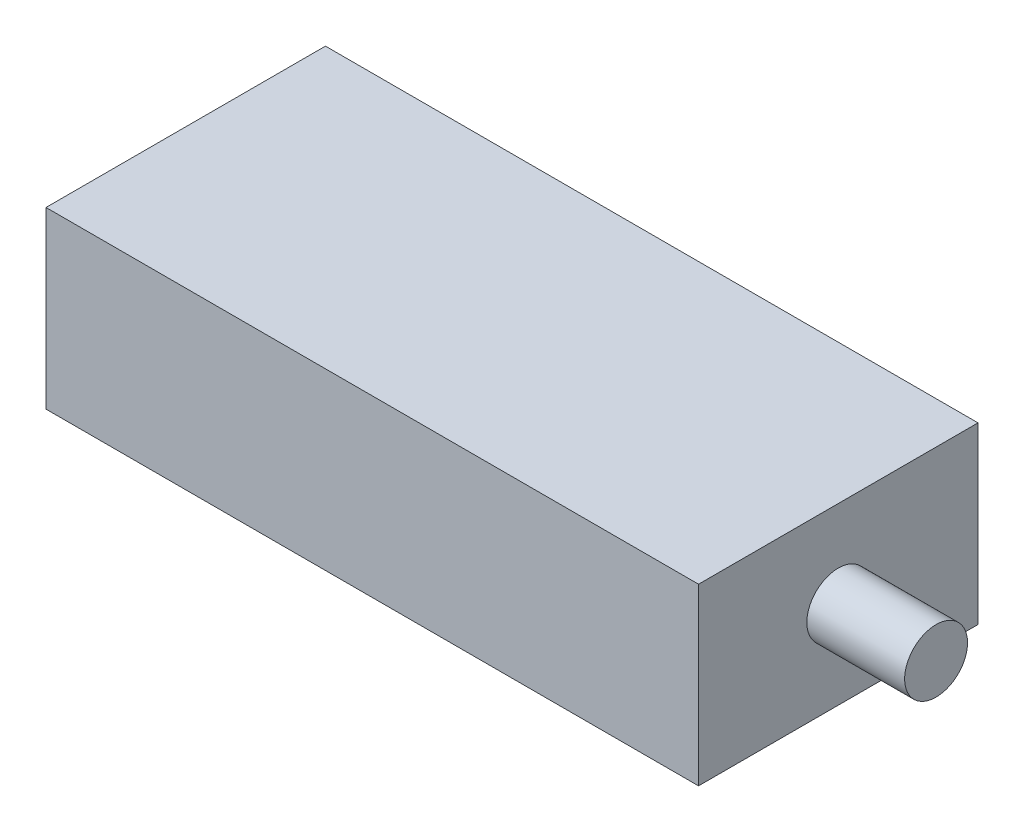
ISO-10303-21;
HEADER;
FILE_DESCRIPTION(('STEP AP214'),'2;1');
FILE_NAME('part.step','',(''),(''),'','','');
FILE_SCHEMA(('AUTOMOTIVE_DESIGN { 1 0 10303 214 1 1 1 1 }'));
ENDSEC;
DATA;
#1=APPLICATION_CONTEXT('core data for automotive mechanical design processes');
#2=APPLICATION_PROTOCOL_DEFINITION('international standard','automotive_design',2000,#1);
#3=PRODUCT_CONTEXT('',#1,'mechanical');
#4=PRODUCT('Part','Part','',(#3));
#5=PRODUCT_RELATED_PRODUCT_CATEGORY('part','',(#4));
#6=PRODUCT_DEFINITION_FORMATION('','',#4);
#7=PRODUCT_DEFINITION_CONTEXT('part definition',#1,'design');
#8=PRODUCT_DEFINITION('design','',#6,#7);
#9=PRODUCT_DEFINITION_SHAPE('','',#8);
#10=(LENGTH_UNIT() NAMED_UNIT(*) SI_UNIT(.MILLI.,.METRE.));
#11=(NAMED_UNIT(*) PLANE_ANGLE_UNIT() SI_UNIT($,.RADIAN.));
#12=(NAMED_UNIT(*) SI_UNIT($,.STERADIAN.) SOLID_ANGLE_UNIT());
#13=UNCERTAINTY_MEASURE_WITH_UNIT(LENGTH_MEASURE(1.E-05),#10,'distance_accuracy_value','');
#14=(GEOMETRIC_REPRESENTATION_CONTEXT(3) GLOBAL_UNCERTAINTY_ASSIGNED_CONTEXT((#13)) GLOBAL_UNIT_ASSIGNED_CONTEXT((#10,
#11,#12)) REPRESENTATION_CONTEXT('',''));
#15=CARTESIAN_POINT('',(0.,0.,0.));
#16=DIRECTION('',(0.,0.,1.));
#17=DIRECTION('',(1.,0.,0.));
#18=AXIS2_PLACEMENT_3D('',#15,#16,#17);
#19=CARTESIAN_POINT('',(59.309,31.75,25.4));
#20=DIRECTION('',(-1.,0.,0.));
#21=DIRECTION('',(0.,0.,1.));
#22=AXIS2_PLACEMENT_3D('',#19,#20,#21);
#23=PLANE('',#22);
#24=CARTESIAN_POINT('',(59.309,15.875,0.));
#25=DIRECTION('',(1.,0.,0.));
#26=DIRECTION('',(0.,0.,-1.));
#27=AXIS2_PLACEMENT_3D('',#24,#25,#26);
#28=CIRCLE('',#27,5.715);
#29=CARTESIAN_POINT('',(59.309,15.875,-5.715));
#30=VERTEX_POINT('',#29);
#31=EDGE_CURVE('E11',#30,#30,#28,.T.);
#32=ORIENTED_EDGE('',*,*,#31,.F.);
#33=EDGE_LOOP('',(#32));
#34=FACE_BOUND('',#33,.T.);
#35=DIRECTION('',(0.,0.,-1.));
#36=VECTOR('',#35,1.);
#37=CARTESIAN_POINT('',(59.309,0.,25.4));
#38=LINE('',#37,#36);
#39=CARTESIAN_POINT('',(59.309,0.,25.4));
#40=VERTEX_POINT('',#39);
#41=CARTESIAN_POINT('',(59.309,0.,-25.4));
#42=VERTEX_POINT('',#41);
#43=EDGE_CURVE('E232',#40,#42,#38,.T.);
#44=ORIENTED_EDGE('',*,*,#43,.T.);
#45=DIRECTION('',(0.,-1.,0.));
#46=VECTOR('',#45,1.);
#47=CARTESIAN_POINT('',(59.309,31.75,-25.4));
#48=LINE('',#47,#46);
#49=CARTESIAN_POINT('',(59.309,31.75,-25.4));
#50=VERTEX_POINT('',#49);
#51=EDGE_CURVE('E36',#50,#42,#48,.T.);
#52=ORIENTED_EDGE('',*,*,#51,.F.);
#53=DIRECTION('',(0.,0.,-1.));
#54=VECTOR('',#53,1.);
#55=CARTESIAN_POINT('',(59.309,31.75,25.4));
#56=LINE('',#55,#54);
#57=CARTESIAN_POINT('',(59.309,31.75,25.4));
#58=VERTEX_POINT('',#57);
#59=EDGE_CURVE('E234',#58,#50,#56,.T.);
#60=ORIENTED_EDGE('',*,*,#59,.F.);
#61=DIRECTION('',(0.,-1.,0.));
#62=VECTOR('',#61,1.);
#63=CARTESIAN_POINT('',(59.309,31.75,25.4));
#64=LINE('',#63,#62);
#65=EDGE_CURVE('E240',#58,#40,#64,.T.);
#66=ORIENTED_EDGE('',*,*,#65,.T.);
#67=EDGE_LOOP('',(#44,#52,#60,#66));
#68=FACE_BOUND('',#67,.T.);
#69=ADVANCED_FACE('F33',(#34,#68),#23,.F.);
#70=CARTESIAN_POINT('',(-59.309,31.75,-25.4));
#71=DIRECTION('',(0.,0.,1.));
#72=DIRECTION('',(1.,0.,0.));
#73=AXIS2_PLACEMENT_3D('',#70,#71,#72);
#74=PLANE('',#73);
#75=DIRECTION('',(-1.,0.,0.));
#76=VECTOR('',#75,1.);
#77=CARTESIAN_POINT('',(-59.309,0.,-25.4));
#78=LINE('',#77,#76);
#79=CARTESIAN_POINT('',(-59.309,0.,-25.4));
#80=VERTEX_POINT('',#79);
#81=EDGE_CURVE('E243',#42,#80,#78,.T.);
#82=ORIENTED_EDGE('',*,*,#81,.T.);
#83=DIRECTION('',(0.,-1.,0.));
#84=VECTOR('',#83,1.);
#85=CARTESIAN_POINT('',(-59.309,31.75,-25.4));
#86=LINE('',#85,#84);
#87=CARTESIAN_POINT('',(-59.309,31.75,-25.4));
#88=VERTEX_POINT('',#87);
#89=EDGE_CURVE('E250',#88,#80,#86,.T.);
#90=ORIENTED_EDGE('',*,*,#89,.F.);
#91=DIRECTION('',(-1.,0.,0.));
#92=VECTOR('',#91,1.);
#93=CARTESIAN_POINT('',(-59.309,31.75,-25.4));
#94=LINE('',#93,#92);
#95=EDGE_CURVE('E86',#50,#88,#94,.T.);
#96=ORIENTED_EDGE('',*,*,#95,.F.);
#97=ORIENTED_EDGE('',*,*,#51,.T.);
#98=EDGE_LOOP('',(#82,#90,#96,#97));
#99=FACE_BOUND('',#98,.T.);
#100=ADVANCED_FACE('F256',(#99),#74,.F.);
#101=CARTESIAN_POINT('',(-59.309,31.75,25.4));
#102=DIRECTION('',(1.,0.,0.));
#103=DIRECTION('',(0.,0.,-1.));
#104=AXIS2_PLACEMENT_3D('',#101,#102,#103);
#105=PLANE('',#104);
#106=DIRECTION('',(0.,0.,1.));
#107=VECTOR('',#106,1.);
#108=CARTESIAN_POINT('',(-59.309,11.6586,-7.9639526005716));
#109=LINE('',#108,#107);
#110=CARTESIAN_POINT('',(-59.309,11.6586,-7.9639526005716));
#111=VERTEX_POINT('',#110);
#112=CARTESIAN_POINT('',(-59.309,11.6586,-2.54));
#113=VERTEX_POINT('',#112);
#114=EDGE_CURVE('E191',#111,#113,#109,.T.);
#115=ORIENTED_EDGE('',*,*,#114,.F.);
#116=CARTESIAN_POINT('',(-59.309,15.875,-5.13051457583911));
#117=DIRECTION('',(-1.,0.,0.));
#118=DIRECTION('',(0.,0.,-1.));
#119=AXIS2_PLACEMENT_3D('',#116,#117,#118);
#120=CIRCLE('',#119,5.08);
#121=CARTESIAN_POINT('',(-59.309,20.0914,-7.9639526005716));
#122=VERTEX_POINT('',#121);
#123=EDGE_CURVE('E48',#122,#111,#120,.T.);
#124=ORIENTED_EDGE('',*,*,#123,.F.);
#125=DIRECTION('',(0.,0.,-1.));
#126=VECTOR('',#125,1.);
#127=CARTESIAN_POINT('',(-59.309,20.0914,-7.9639526005716));
#128=LINE('',#127,#126);
#129=CARTESIAN_POINT('',(-59.309,20.0914,-2.54));
#130=VERTEX_POINT('',#129);
#131=EDGE_CURVE('E165',#130,#122,#128,.T.);
#132=ORIENTED_EDGE('',*,*,#131,.F.);
#133=DIRECTION('',(0.,0.707106781186548,-0.707106781186547));
#134=VECTOR('',#133,1.);
#135=CARTESIAN_POINT('',(-59.309,20.0914,-2.54));
#136=LINE('',#135,#134);
#137=CARTESIAN_POINT('',(-59.309,17.5514,0.));
#138=VERTEX_POINT('',#137);
#139=EDGE_CURVE('E168',#138,#130,#136,.T.);
#140=ORIENTED_EDGE('',*,*,#139,.F.);
#141=DIRECTION('',(0.,-0.707106781186548,-0.707106781186548));
#142=VECTOR('',#141,1.);
#143=CARTESIAN_POINT('',(-59.309,20.0914,2.54));
#144=LINE('',#143,#142);
#145=CARTESIAN_POINT('',(-59.309,20.0914,2.54));
#146=VERTEX_POINT('',#145);
#147=EDGE_CURVE('E208',#146,#138,#144,.T.);
#148=ORIENTED_EDGE('',*,*,#147,.F.);
#149=DIRECTION('',(0.,0.,-1.));
#150=VECTOR('',#149,1.);
#151=CARTESIAN_POINT('',(-59.309,20.0914,7.9639526005716));
#152=LINE('',#151,#150);
#153=CARTESIAN_POINT('',(-59.309,20.0914,7.9639526005716));
#154=VERTEX_POINT('',#153);
#155=EDGE_CURVE('E205',#154,#146,#152,.T.);
#156=ORIENTED_EDGE('',*,*,#155,.F.);
#157=CARTESIAN_POINT('',(-59.309,15.875,5.13051457583911));
#158=DIRECTION('',(-1.,0.,0.));
#159=DIRECTION('',(0.,0.,1.));
#160=AXIS2_PLACEMENT_3D('',#157,#158,#159);
#161=CIRCLE('',#160,5.08);
#162=CARTESIAN_POINT('',(-59.309,11.6586,7.9639526005716));
#163=VERTEX_POINT('',#162);
#164=EDGE_CURVE('E202',#163,#154,#161,.T.);
#165=ORIENTED_EDGE('',*,*,#164,.F.);
#166=DIRECTION('',(0.,0.,1.));
#167=VECTOR('',#166,1.);
#168=CARTESIAN_POINT('',(-59.309,11.6586,7.9639526005716));
#169=LINE('',#168,#167);
#170=CARTESIAN_POINT('',(-59.309,11.6586,2.54));
#171=VERTEX_POINT('',#170);
#172=EDGE_CURVE('E199',#171,#163,#169,.T.);
#173=ORIENTED_EDGE('',*,*,#172,.F.);
#174=DIRECTION('',(0.,-0.707106781186548,0.707106781186547));
#175=VECTOR('',#174,1.);
#176=CARTESIAN_POINT('',(-59.309,11.6586,2.54));
#177=LINE('',#176,#175);
#178=CARTESIAN_POINT('',(-59.309,14.1986,0.));
#179=VERTEX_POINT('',#178);
#180=EDGE_CURVE('E196',#179,#171,#177,.T.);
#181=ORIENTED_EDGE('',*,*,#180,.F.);
#182=DIRECTION('',(0.,0.707106781186547,0.707106781186548));
#183=VECTOR('',#182,1.);
#184=CARTESIAN_POINT('',(-59.309,11.6586,-2.54));
#185=LINE('',#184,#183);
#186=EDGE_CURVE('E193',#113,#179,#185,.T.);
#187=ORIENTED_EDGE('',*,*,#186,.F.);
#188=EDGE_LOOP('',(#115,#124,#132,#140,#148,#156,#165,#173,#181,#187));
#189=FACE_BOUND('',#188,.T.);
#190=DIRECTION('',(0.,0.,1.));
#191=VECTOR('',#190,1.);
#192=CARTESIAN_POINT('',(-59.309,0.,25.4));
#193=LINE('',#192,#191);
#194=CARTESIAN_POINT('',(-59.309,0.,25.4));
#195=VERTEX_POINT('',#194);
#196=EDGE_CURVE('E245',#80,#195,#193,.T.);
#197=ORIENTED_EDGE('',*,*,#196,.T.);
#198=DIRECTION('',(0.,-1.,0.));
#199=VECTOR('',#198,1.);
#200=CARTESIAN_POINT('',(-59.309,31.75,25.4));
#201=LINE('',#200,#199);
#202=CARTESIAN_POINT('',(-59.309,31.75,25.4));
#203=VERTEX_POINT('',#202);
#204=EDGE_CURVE('E249',#203,#195,#201,.T.);
#205=ORIENTED_EDGE('',*,*,#204,.F.);
#206=DIRECTION('',(0.,0.,1.));
#207=VECTOR('',#206,1.);
#208=CARTESIAN_POINT('',(-59.309,31.75,25.4));
#209=LINE('',#208,#207);
#210=EDGE_CURVE('E237',#88,#203,#209,.T.);
#211=ORIENTED_EDGE('',*,*,#210,.F.);
#212=ORIENTED_EDGE('',*,*,#89,.T.);
#213=EDGE_LOOP('',(#197,#205,#211,#212));
#214=FACE_BOUND('',#213,.T.);
#215=ADVANCED_FACE('F263',(#189,#214),#105,.F.);
#216=CARTESIAN_POINT('',(-59.309,31.75,25.4));
#217=DIRECTION('',(0.,0.,-1.));
#218=DIRECTION('',(-1.,0.,0.));
#219=AXIS2_PLACEMENT_3D('',#216,#217,#218);
#220=PLANE('',#219);
#221=DIRECTION('',(1.,0.,0.));
#222=VECTOR('',#221,1.);
#223=CARTESIAN_POINT('',(-59.309,0.,25.4));
#224=LINE('',#223,#222);
#225=EDGE_CURVE('E78',#195,#40,#224,.T.);
#226=ORIENTED_EDGE('',*,*,#225,.T.);
#227=ORIENTED_EDGE('',*,*,#65,.F.);
#228=DIRECTION('',(1.,0.,0.));
#229=VECTOR('',#228,1.);
#230=CARTESIAN_POINT('',(-59.309,31.75,25.4));
#231=LINE('',#230,#229);
#232=EDGE_CURVE('E57',#203,#58,#231,.T.);
#233=ORIENTED_EDGE('',*,*,#232,.F.);
#234=ORIENTED_EDGE('',*,*,#204,.T.);
#235=EDGE_LOOP('',(#226,#227,#233,#234));
#236=FACE_BOUND('',#235,.T.);
#237=ADVANCED_FACE('F264',(#236),#220,.F.);
#238=CARTESIAN_POINT('',(0.,31.75,0.));
#239=DIRECTION('',(0.,-1.,0.));
#240=DIRECTION('',(0.,0.,-1.));
#241=AXIS2_PLACEMENT_3D('',#238,#239,#240);
#242=PLANE('',#241);
#243=ORIENTED_EDGE('',*,*,#59,.T.);
#244=ORIENTED_EDGE('',*,*,#95,.T.);
#245=ORIENTED_EDGE('',*,*,#210,.T.);
#246=ORIENTED_EDGE('',*,*,#232,.T.);
#247=EDGE_LOOP('',(#243,#244,#245,#246));
#248=FACE_BOUND('',#247,.T.);
#249=ADVANCED_FACE('F265',(#248),#242,.F.);
#250=CARTESIAN_POINT('',(0.,0.,0.));
#251=DIRECTION('',(0.,-1.,0.));
#252=DIRECTION('',(0.,0.,-1.));
#253=AXIS2_PLACEMENT_3D('',#250,#251,#252);
#254=PLANE('',#253);
#255=ORIENTED_EDGE('',*,*,#43,.F.);
#256=ORIENTED_EDGE('',*,*,#225,.F.);
#257=ORIENTED_EDGE('',*,*,#196,.F.);
#258=ORIENTED_EDGE('',*,*,#81,.F.);
#259=EDGE_LOOP('',(#255,#256,#257,#258));
#260=FACE_BOUND('',#259,.T.);
#261=ADVANCED_FACE('F261',(#260),#254,.T.);
#262=CARTESIAN_POINT('',(77.089,15.875,0.));
#263=DIRECTION('',(-1.,0.,0.));
#264=DIRECTION('',(0.,0.,1.));
#265=AXIS2_PLACEMENT_3D('',#262,#263,#264);
#266=CYLINDRICAL_SURFACE('',#265,5.715);
#267=CARTESIAN_POINT('',(77.089,15.875,0.));
#268=DIRECTION('',(1.,0.,0.));
#269=DIRECTION('',(0.,0.,-1.));
#270=AXIS2_PLACEMENT_3D('',#267,#268,#269);
#271=CIRCLE('',#270,5.715);
#272=CARTESIAN_POINT('',(77.089,15.875,-5.715));
#273=VERTEX_POINT('',#272);
#274=EDGE_CURVE('E215',#273,#273,#271,.T.);
#275=ORIENTED_EDGE('',*,*,#274,.F.);
#276=EDGE_LOOP('',(#275));
#277=FACE_BOUND('',#276,.T.);
#278=ORIENTED_EDGE('',*,*,#31,.T.);
#279=EDGE_LOOP('',(#278));
#280=FACE_BOUND('',#279,.T.);
#281=ADVANCED_FACE('F272',(#277,#280),#266,.T.);
#282=CARTESIAN_POINT('',(77.089,15.875,0.));
#283=DIRECTION('',(1.,0.,0.));
#284=DIRECTION('',(0.,0.,-1.));
#285=AXIS2_PLACEMENT_3D('',#282,#283,#284);
#286=PLANE('',#285);
#287=ORIENTED_EDGE('',*,*,#274,.T.);
#288=EDGE_LOOP('',(#287));
#289=FACE_BOUND('',#288,.T.);
#290=ADVANCED_FACE('F286',(#289),#286,.T.);
#291=CARTESIAN_POINT('',(-49.403,15.875,-5.13051457583911));
#292=DIRECTION('',(-1.,0.,0.));
#293=DIRECTION('',(0.,0.,1.));
#294=AXIS2_PLACEMENT_3D('',#291,#292,#293);
#295=CYLINDRICAL_SURFACE('',#294,5.08);
#296=ORIENTED_EDGE('',*,*,#123,.T.);
#297=DIRECTION('',(-1.,0.,0.));
#298=VECTOR('',#297,1.);
#299=CARTESIAN_POINT('',(-49.403,11.6586,-7.9639526005716));
#300=LINE('',#299,#298);
#301=CARTESIAN_POINT('',(-49.403,11.6586,-7.9639526005716));
#302=VERTEX_POINT('',#301);
#303=EDGE_CURVE('E142',#302,#111,#300,.T.);
#304=ORIENTED_EDGE('',*,*,#303,.F.);
#305=CARTESIAN_POINT('',(-49.403,15.875,-5.13051457583911));
#306=DIRECTION('',(-1.,0.,0.));
#307=DIRECTION('',(0.,0.,-1.));
#308=AXIS2_PLACEMENT_3D('',#305,#306,#307);
#309=CIRCLE('',#308,5.08);
#310=CARTESIAN_POINT('',(-49.403,20.0914,-7.9639526005716));
#311=VERTEX_POINT('',#310);
#312=EDGE_CURVE('E146',#311,#302,#309,.T.);
#313=ORIENTED_EDGE('',*,*,#312,.F.);
#314=DIRECTION('',(-1.,0.,0.));
#315=VECTOR('',#314,1.);
#316=CARTESIAN_POINT('',(-49.403,20.0914,-7.9639526005716));
#317=LINE('',#316,#315);
#318=EDGE_CURVE('E213',#311,#122,#317,.T.);
#319=ORIENTED_EDGE('',*,*,#318,.T.);
#320=EDGE_LOOP('',(#296,#304,#313,#319));
#321=FACE_BOUND('',#320,.T.);
#322=ADVANCED_FACE('F144',(#321),#295,.F.);
#323=CARTESIAN_POINT('',(-49.403,20.0914,-7.9639526005716));
#324=DIRECTION('',(0.,1.,0.));
#325=DIRECTION('',(0.,0.,1.));
#326=AXIS2_PLACEMENT_3D('',#323,#324,#325);
#327=PLANE('',#326);
#328=ORIENTED_EDGE('',*,*,#131,.T.);
#329=ORIENTED_EDGE('',*,*,#318,.F.);
#330=DIRECTION('',(0.,0.,-1.));
#331=VECTOR('',#330,1.);
#332=CARTESIAN_POINT('',(-49.403,20.0914,-7.9639526005716));
#333=LINE('',#332,#331);
#334=CARTESIAN_POINT('',(-49.403,20.0914,-2.54));
#335=VERTEX_POINT('',#334);
#336=EDGE_CURVE('E152',#335,#311,#333,.T.);
#337=ORIENTED_EDGE('',*,*,#336,.F.);
#338=DIRECTION('',(-1.,0.,0.));
#339=VECTOR('',#338,1.);
#340=CARTESIAN_POINT('',(-49.403,20.0914,-2.54));
#341=LINE('',#340,#339);
#342=EDGE_CURVE('E216',#335,#130,#341,.T.);
#343=ORIENTED_EDGE('',*,*,#342,.T.);
#344=EDGE_LOOP('',(#328,#329,#337,#343));
#345=FACE_BOUND('',#344,.T.);
#346=ADVANCED_FACE('F296',(#345),#327,.F.);
#347=CARTESIAN_POINT('',(-49.403,20.0914,-2.54));
#348=DIRECTION('',(0.,0.707106781186547,0.707106781186548));
#349=DIRECTION('',(0.,-0.707106781186548,0.707106781186547));
#350=AXIS2_PLACEMENT_3D('',#347,#348,#349);
#351=PLANE('',#350);
#352=ORIENTED_EDGE('',*,*,#139,.T.);
#353=ORIENTED_EDGE('',*,*,#342,.F.);
#354=DIRECTION('',(0.,0.707106781186548,-0.707106781186547));
#355=VECTOR('',#354,1.);
#356=CARTESIAN_POINT('',(-49.403,20.0914,-2.54));
#357=LINE('',#356,#355);
#358=CARTESIAN_POINT('',(-49.403,17.5514,0.));
#359=VERTEX_POINT('',#358);
#360=EDGE_CURVE('E187',#359,#335,#357,.T.);
#361=ORIENTED_EDGE('',*,*,#360,.F.);
#362=DIRECTION('',(-1.,0.,0.));
#363=VECTOR('',#362,1.);
#364=CARTESIAN_POINT('',(-49.403,17.5514,0.));
#365=LINE('',#364,#363);
#366=EDGE_CURVE('E218',#359,#138,#365,.T.);
#367=ORIENTED_EDGE('',*,*,#366,.T.);
#368=EDGE_LOOP('',(#352,#353,#361,#367));
#369=FACE_BOUND('',#368,.T.);
#370=ADVANCED_FACE('F322',(#369),#351,.F.);
#371=CARTESIAN_POINT('',(-49.403,20.0914,2.54));
#372=DIRECTION('',(0.,0.707106781186548,-0.707106781186548));
#373=DIRECTION('',(0.,0.707106781186548,0.707106781186548));
#374=AXIS2_PLACEMENT_3D('',#371,#372,#373);
#375=PLANE('',#374);
#376=ORIENTED_EDGE('',*,*,#147,.T.);
#377=ORIENTED_EDGE('',*,*,#366,.F.);
#378=DIRECTION('',(0.,-0.707106781186548,-0.707106781186548));
#379=VECTOR('',#378,1.);
#380=CARTESIAN_POINT('',(-49.403,20.0914,2.54));
#381=LINE('',#380,#379);
#382=CARTESIAN_POINT('',(-49.403,20.0914,2.54));
#383=VERTEX_POINT('',#382);
#384=EDGE_CURVE('E184',#383,#359,#381,.T.);
#385=ORIENTED_EDGE('',*,*,#384,.F.);
#386=DIRECTION('',(-1.,0.,0.));
#387=VECTOR('',#386,1.);
#388=CARTESIAN_POINT('',(-49.403,20.0914,2.54));
#389=LINE('',#388,#387);
#390=EDGE_CURVE('E220',#383,#146,#389,.T.);
#391=ORIENTED_EDGE('',*,*,#390,.T.);
#392=EDGE_LOOP('',(#376,#377,#385,#391));
#393=FACE_BOUND('',#392,.T.);
#394=ADVANCED_FACE('F318',(#393),#375,.F.);
#395=CARTESIAN_POINT('',(-49.403,20.0914,7.9639526005716));
#396=DIRECTION('',(0.,1.,0.));
#397=DIRECTION('',(0.,0.,1.));
#398=AXIS2_PLACEMENT_3D('',#395,#396,#397);
#399=PLANE('',#398);
#400=ORIENTED_EDGE('',*,*,#155,.T.);
#401=ORIENTED_EDGE('',*,*,#390,.F.);
#402=DIRECTION('',(0.,0.,-1.));
#403=VECTOR('',#402,1.);
#404=CARTESIAN_POINT('',(-49.403,20.0914,7.9639526005716));
#405=LINE('',#404,#403);
#406=CARTESIAN_POINT('',(-49.403,20.0914,7.9639526005716));
#407=VERTEX_POINT('',#406);
#408=EDGE_CURVE('E181',#407,#383,#405,.T.);
#409=ORIENTED_EDGE('',*,*,#408,.F.);
#410=DIRECTION('',(-1.,0.,0.));
#411=VECTOR('',#410,1.);
#412=CARTESIAN_POINT('',(-49.403,20.0914,7.9639526005716));
#413=LINE('',#412,#411);
#414=EDGE_CURVE('E222',#407,#154,#413,.T.);
#415=ORIENTED_EDGE('',*,*,#414,.T.);
#416=EDGE_LOOP('',(#400,#401,#409,#415));
#417=FACE_BOUND('',#416,.T.);
#418=ADVANCED_FACE('F314',(#417),#399,.F.);
#419=CARTESIAN_POINT('',(-49.403,15.875,5.13051457583911));
#420=DIRECTION('',(-1.,0.,0.));
#421=DIRECTION('',(0.,0.,1.));
#422=AXIS2_PLACEMENT_3D('',#419,#420,#421);
#423=CYLINDRICAL_SURFACE('',#422,5.08);
#424=ORIENTED_EDGE('',*,*,#164,.T.);
#425=ORIENTED_EDGE('',*,*,#414,.F.);
#426=CARTESIAN_POINT('',(-49.403,15.875,5.13051457583911));
#427=DIRECTION('',(-1.,0.,0.));
#428=DIRECTION('',(0.,0.,1.));
#429=AXIS2_PLACEMENT_3D('',#426,#427,#428);
#430=CIRCLE('',#429,5.08);
#431=CARTESIAN_POINT('',(-49.403,11.6586,7.9639526005716));
#432=VERTEX_POINT('',#431);
#433=EDGE_CURVE('E178',#432,#407,#430,.T.);
#434=ORIENTED_EDGE('',*,*,#433,.F.);
#435=DIRECTION('',(-1.,0.,0.));
#436=VECTOR('',#435,1.);
#437=CARTESIAN_POINT('',(-49.403,11.6586,7.9639526005716));
#438=LINE('',#437,#436);
#439=EDGE_CURVE('E224',#432,#163,#438,.T.);
#440=ORIENTED_EDGE('',*,*,#439,.T.);
#441=EDGE_LOOP('',(#424,#425,#434,#440));
#442=FACE_BOUND('',#441,.T.);
#443=ADVANCED_FACE('F310',(#442),#423,.F.);
#444=CARTESIAN_POINT('',(-49.403,11.6586,7.9639526005716));
#445=DIRECTION('',(0.,-1.,0.));
#446=DIRECTION('',(0.,0.,-1.));
#447=AXIS2_PLACEMENT_3D('',#444,#445,#446);
#448=PLANE('',#447);
#449=ORIENTED_EDGE('',*,*,#172,.T.);
#450=ORIENTED_EDGE('',*,*,#439,.F.);
#451=DIRECTION('',(0.,0.,1.));
#452=VECTOR('',#451,1.);
#453=CARTESIAN_POINT('',(-49.403,11.6586,7.9639526005716));
#454=LINE('',#453,#452);
#455=CARTESIAN_POINT('',(-49.403,11.6586,2.54));
#456=VERTEX_POINT('',#455);
#457=EDGE_CURVE('E175',#456,#432,#454,.T.);
#458=ORIENTED_EDGE('',*,*,#457,.F.);
#459=DIRECTION('',(-1.,0.,0.));
#460=VECTOR('',#459,1.);
#461=CARTESIAN_POINT('',(-49.403,11.6586,2.54));
#462=LINE('',#461,#460);
#463=EDGE_CURVE('E226',#456,#171,#462,.T.);
#464=ORIENTED_EDGE('',*,*,#463,.T.);
#465=EDGE_LOOP('',(#449,#450,#458,#464));
#466=FACE_BOUND('',#465,.T.);
#467=ADVANCED_FACE('F306',(#466),#448,.F.);
#468=CARTESIAN_POINT('',(-49.403,11.6586,2.54));
#469=DIRECTION('',(0.,-0.707106781186547,-0.707106781186548));
#470=DIRECTION('',(0.,0.707106781186548,-0.707106781186547));
#471=AXIS2_PLACEMENT_3D('',#468,#469,#470);
#472=PLANE('',#471);
#473=ORIENTED_EDGE('',*,*,#180,.T.);
#474=ORIENTED_EDGE('',*,*,#463,.F.);
#475=DIRECTION('',(0.,-0.707106781186548,0.707106781186547));
#476=VECTOR('',#475,1.);
#477=CARTESIAN_POINT('',(-49.403,11.6586,2.54));
#478=LINE('',#477,#476);
#479=CARTESIAN_POINT('',(-49.403,14.1986,0.));
#480=VERTEX_POINT('',#479);
#481=EDGE_CURVE('E172',#480,#456,#478,.T.);
#482=ORIENTED_EDGE('',*,*,#481,.F.);
#483=DIRECTION('',(-1.,0.,0.));
#484=VECTOR('',#483,1.);
#485=CARTESIAN_POINT('',(-49.403,14.1986,0.));
#486=LINE('',#485,#484);
#487=EDGE_CURVE('E228',#480,#179,#486,.T.);
#488=ORIENTED_EDGE('',*,*,#487,.T.);
#489=EDGE_LOOP('',(#473,#474,#482,#488));
#490=FACE_BOUND('',#489,.T.);
#491=ADVANCED_FACE('F302',(#490),#472,.F.);
#492=CARTESIAN_POINT('',(-49.403,11.6586,-2.54));
#493=DIRECTION('',(0.,-0.707106781186548,0.707106781186547));
#494=DIRECTION('',(0.,-0.707106781186547,-0.707106781186548));
#495=AXIS2_PLACEMENT_3D('',#492,#493,#494);
#496=PLANE('',#495);
#497=ORIENTED_EDGE('',*,*,#186,.T.);
#498=ORIENTED_EDGE('',*,*,#487,.F.);
#499=DIRECTION('',(0.,0.707106781186547,0.707106781186548));
#500=VECTOR('',#499,1.);
#501=CARTESIAN_POINT('',(-49.403,11.6586,-2.54));
#502=LINE('',#501,#500);
#503=CARTESIAN_POINT('',(-49.403,11.6586,-2.54));
#504=VERTEX_POINT('',#503);
#505=EDGE_CURVE('E160',#504,#480,#502,.T.);
#506=ORIENTED_EDGE('',*,*,#505,.F.);
#507=DIRECTION('',(-1.,0.,0.));
#508=VECTOR('',#507,1.);
#509=CARTESIAN_POINT('',(-49.403,11.6586,-2.54));
#510=LINE('',#509,#508);
#511=EDGE_CURVE('E151',#504,#113,#510,.T.);
#512=ORIENTED_EDGE('',*,*,#511,.T.);
#513=EDGE_LOOP('',(#497,#498,#506,#512));
#514=FACE_BOUND('',#513,.T.);
#515=ADVANCED_FACE('F299',(#514),#496,.F.);
#516=CARTESIAN_POINT('',(-49.403,11.6586,-7.9639526005716));
#517=DIRECTION('',(0.,-1.,0.));
#518=DIRECTION('',(0.,0.,-1.));
#519=AXIS2_PLACEMENT_3D('',#516,#517,#518);
#520=PLANE('',#519);
#521=ORIENTED_EDGE('',*,*,#114,.T.);
#522=ORIENTED_EDGE('',*,*,#511,.F.);
#523=DIRECTION('',(0.,0.,1.));
#524=VECTOR('',#523,1.);
#525=CARTESIAN_POINT('',(-49.403,11.6586,-7.9639526005716));
#526=LINE('',#525,#524);
#527=EDGE_CURVE('E155',#302,#504,#526,.T.);
#528=ORIENTED_EDGE('',*,*,#527,.F.);
#529=ORIENTED_EDGE('',*,*,#303,.T.);
#530=EDGE_LOOP('',(#521,#522,#528,#529));
#531=FACE_BOUND('',#530,.T.);
#532=ADVANCED_FACE('F156',(#531),#520,.F.);
#533=CARTESIAN_POINT('',(-49.403,15.875,-5.13051457583911));
#534=DIRECTION('',(1.,0.,0.));
#535=DIRECTION('',(0.,0.,-1.));
#536=AXIS2_PLACEMENT_3D('',#533,#534,#535);
#537=PLANE('',#536);
#538=ORIENTED_EDGE('',*,*,#312,.T.);
#539=ORIENTED_EDGE('',*,*,#527,.T.);
#540=ORIENTED_EDGE('',*,*,#505,.T.);
#541=ORIENTED_EDGE('',*,*,#481,.T.);
#542=ORIENTED_EDGE('',*,*,#457,.T.);
#543=ORIENTED_EDGE('',*,*,#433,.T.);
#544=ORIENTED_EDGE('',*,*,#408,.T.);
#545=ORIENTED_EDGE('',*,*,#384,.T.);
#546=ORIENTED_EDGE('',*,*,#360,.T.);
#547=ORIENTED_EDGE('',*,*,#336,.T.);
#548=EDGE_LOOP('',(#538,#539,#540,#541,#542,#543,#544,#545,#546,#547));
#549=FACE_BOUND('',#548,.T.);
#550=ADVANCED_FACE('F162',(#549),#537,.F.);
#551=CLOSED_SHELL('',(#69,#100,#215,#237,#249,#261,#281,#290,#322,#346,#370,#394,#418,#443,#467,
#491,#515,#532,#550));
#552=MANIFOLD_SOLID_BREP('B2',#551);
#553=ADVANCED_BREP_SHAPE_REPRESENTATION('',(#18,#552),#14);
#554=SHAPE_DEFINITION_REPRESENTATION(#9,#553);
ENDSEC;
END-ISO-10303-21;
